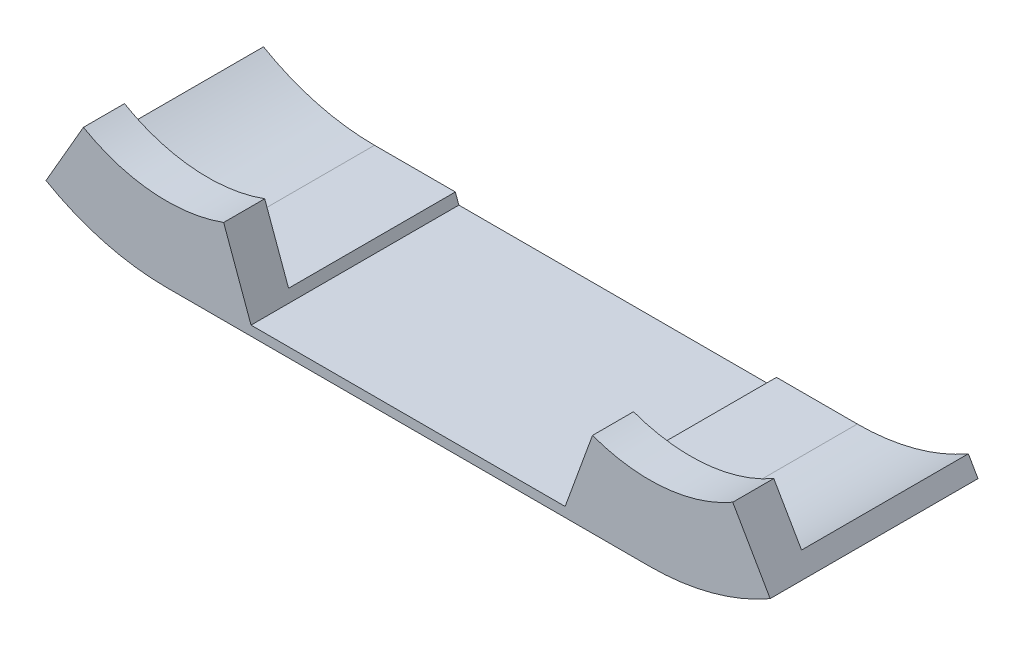
ISO-10303-21;
HEADER;
FILE_DESCRIPTION(('STEP AP214'),'2;1');
FILE_NAME('part.step','',(''),(''),'','','');
FILE_SCHEMA(('AUTOMOTIVE_DESIGN { 1 0 10303 214 1 1 1 1 }'));
ENDSEC;
DATA;
#1=APPLICATION_CONTEXT('core data for automotive mechanical design processes');
#2=APPLICATION_PROTOCOL_DEFINITION('international standard','automotive_design',2000,#1);
#3=PRODUCT_CONTEXT('',#1,'mechanical');
#4=PRODUCT('Part','Part','',(#3));
#5=PRODUCT_RELATED_PRODUCT_CATEGORY('part','',(#4));
#6=PRODUCT_DEFINITION_FORMATION('','',#4);
#7=PRODUCT_DEFINITION_CONTEXT('part definition',#1,'design');
#8=PRODUCT_DEFINITION('design','',#6,#7);
#9=PRODUCT_DEFINITION_SHAPE('','',#8);
#10=(LENGTH_UNIT() NAMED_UNIT(*) SI_UNIT(.MILLI.,.METRE.));
#11=(NAMED_UNIT(*) PLANE_ANGLE_UNIT() SI_UNIT($,.RADIAN.));
#12=(NAMED_UNIT(*) SI_UNIT($,.STERADIAN.) SOLID_ANGLE_UNIT());
#13=UNCERTAINTY_MEASURE_WITH_UNIT(LENGTH_MEASURE(1.E-05),#10,'distance_accuracy_value','');
#14=(GEOMETRIC_REPRESENTATION_CONTEXT(3) GLOBAL_UNCERTAINTY_ASSIGNED_CONTEXT((#13)) GLOBAL_UNIT_ASSIGNED_CONTEXT((#10,
#11,#12)) REPRESENTATION_CONTEXT('',''));
#15=CARTESIAN_POINT('',(0.,0.,0.));
#16=DIRECTION('',(0.,0.,1.));
#17=DIRECTION('',(1.,0.,0.));
#18=AXIS2_PLACEMENT_3D('',#15,#16,#17);
#19=CARTESIAN_POINT('',(0.,0.,0.));
#20=DIRECTION('',(0.,0.,-1.));
#21=DIRECTION('',(-1.,0.,0.));
#22=AXIS2_PLACEMENT_3D('',#19,#20,#21);
#23=PLANE('',#22);
#24=DIRECTION('',(-0.500000000000002,0.866025403784437,0.));
#25=VECTOR('',#24,1.);
#26=CARTESIAN_POINT('',(125.,-43.3012701892219,0.));
#27=LINE('',#26,#25);
#28=CARTESIAN_POINT('',(123.,-39.8371685740842,0.));
#29=VERTEX_POINT('',#28);
#30=CARTESIAN_POINT('',(117.25,-29.8778764305631,0.));
#31=VERTEX_POINT('',#30);
#32=EDGE_CURVE('E145',#29,#31,#27,.T.);
#33=ORIENTED_EDGE('',*,*,#32,.F.);
#34=CARTESIAN_POINT('',(100.,0.,0.));
#35=DIRECTION('',(0.,0.,-1.));
#36=DIRECTION('',(1.,0.,0.));
#37=AXIS2_PLACEMENT_3D('',#34,#35,#36);
#38=CIRCLE('',#37,46.);
#39=CARTESIAN_POINT('',(100.,-46.,0.));
#40=VERTEX_POINT('',#39);
#41=EDGE_CURVE('E254',#29,#40,#38,.T.);
#42=ORIENTED_EDGE('',*,*,#41,.T.);
#43=DIRECTION('',(-1.,0.,0.));
#44=VECTOR('',#43,1.);
#45=CARTESIAN_POINT('',(100.,-46.,0.));
#46=LINE('',#45,#44);
#47=CARTESIAN_POINT('',(83.2573692237546,-46.,0.));
#48=VERTEX_POINT('',#47);
#49=EDGE_CURVE('E258',#40,#48,#46,.T.);
#50=ORIENTED_EDGE('',*,*,#49,.T.);
#51=DIRECTION('',(-0.34202014332567,-0.939692620785908,0.));
#52=VECTOR('',#51,1.);
#53=CARTESIAN_POINT('',(88.2003050552644,-32.4193954171138,0.));
#54=LINE('',#53,#52);
#55=CARTESIAN_POINT('',(88.2003050552644,-32.4193954171138,0.));
#56=VERTEX_POINT('',#55);
#57=EDGE_CURVE('E152',#56,#48,#54,.T.);
#58=ORIENTED_EDGE('',*,*,#57,.F.);
#59=CARTESIAN_POINT('',(100.,0.,0.));
#60=DIRECTION('',(0.,0.,-1.));
#61=DIRECTION('',(-1.,0.,0.));
#62=AXIS2_PLACEMENT_3D('',#59,#60,#61);
#63=CIRCLE('',#62,34.5);
#64=EDGE_CURVE('E148',#31,#56,#63,.T.);
#65=ORIENTED_EDGE('',*,*,#64,.F.);
#66=EDGE_LOOP('',(#33,#42,#50,#58,#65));
#67=FACE_BOUND('',#66,.T.);
#68=ADVANCED_FACE('F39',(#67),#23,.T.);
#69=DIRECTION('',(-1.,0.,0.));
#70=VECTOR('',#69,1.);
#71=CARTESIAN_POINT('',(0.,-46.,0.));
#72=LINE('',#71,#70);
#73=CARTESIAN_POINT('',(16.7426307762454,-46.,0.));
#74=VERTEX_POINT('',#73);
#75=CARTESIAN_POINT('',(0.,-46.,0.));
#76=VERTEX_POINT('',#75);
#77=EDGE_CURVE('E262',#74,#76,#72,.T.);
#78=ORIENTED_EDGE('',*,*,#77,.T.);
#79=CARTESIAN_POINT('',(0.,0.,0.));
#80=DIRECTION('',(0.,0.,-1.));
#81=DIRECTION('',(-1.,0.,0.));
#82=AXIS2_PLACEMENT_3D('',#79,#80,#81);
#83=CIRCLE('',#82,46.);
#84=CARTESIAN_POINT('',(-23.,-39.8371685740842,0.));
#85=VERTEX_POINT('',#84);
#86=EDGE_CURVE('E55',#76,#85,#83,.T.);
#87=ORIENTED_EDGE('',*,*,#86,.T.);
#88=DIRECTION('',(-0.500000000000001,-0.866025403784438,0.));
#89=VECTOR('',#88,1.);
#90=CARTESIAN_POINT('',(-25.,-43.3012701892219,0.));
#91=LINE('',#90,#89);
#92=CARTESIAN_POINT('',(-17.25,-29.8778764305631,0.));
#93=VERTEX_POINT('',#92);
#94=EDGE_CURVE('E160',#93,#85,#91,.T.);
#95=ORIENTED_EDGE('',*,*,#94,.F.);
#96=CARTESIAN_POINT('',(0.,0.,0.));
#97=DIRECTION('',(0.,0.,-1.));
#98=DIRECTION('',(-1.,0.,0.));
#99=AXIS2_PLACEMENT_3D('',#96,#97,#98);
#100=CIRCLE('',#99,34.5);
#101=CARTESIAN_POINT('',(11.7996949447356,-32.4193954171138,0.));
#102=VERTEX_POINT('',#101);
#103=EDGE_CURVE('E86',#102,#93,#100,.T.);
#104=ORIENTED_EDGE('',*,*,#103,.F.);
#105=DIRECTION('',(-0.34202014332567,0.939692620785908,0.));
#106=VECTOR('',#105,1.);
#107=CARTESIAN_POINT('',(11.7996949447356,-32.4193954171138,0.));
#108=LINE('',#107,#106);
#109=EDGE_CURVE('E132',#74,#102,#108,.T.);
#110=ORIENTED_EDGE('',*,*,#109,.F.);
#111=EDGE_LOOP('',(#78,#87,#95,#104,#110));
#112=FACE_BOUND('',#111,.T.);
#113=ADVANCED_FACE('F373',(#112),#23,.T.);
#114=CARTESIAN_POINT('',(0.,0.,8.5));
#115=DIRECTION('',(0.,0.,-1.));
#116=DIRECTION('',(-1.,0.,0.));
#117=AXIS2_PLACEMENT_3D('',#114,#115,#116);
#118=CYLINDRICAL_SURFACE('',#117,50.);
#119=DIRECTION('',(0.,0.,-1.));
#120=VECTOR('',#119,1.);
#121=CARTESIAN_POINT('',(-25.,-43.3012701892219,8.5));
#122=LINE('',#121,#120);
#123=CARTESIAN_POINT('',(-25.,-43.3012701892219,8.5));
#124=VERTEX_POINT('',#123);
#125=CARTESIAN_POINT('',(-25.,-43.3012701892219,-34.55));
#126=VERTEX_POINT('',#125);
#127=EDGE_CURVE('E141',#124,#126,#122,.T.);
#128=ORIENTED_EDGE('',*,*,#127,.T.);
#129=CARTESIAN_POINT('',(0.,0.,-34.55));
#130=DIRECTION('',(0.,0.,1.));
#131=DIRECTION('',(1.,0.,0.));
#132=AXIS2_PLACEMENT_3D('',#129,#130,#131);
#133=CIRCLE('',#132,50.);
#134=CARTESIAN_POINT('',(0.,-50.,-34.55));
#135=VERTEX_POINT('',#134);
#136=EDGE_CURVE('E218',#126,#135,#133,.T.);
#137=ORIENTED_EDGE('',*,*,#136,.T.);
#138=DIRECTION('',(0.,0.,-1.));
#139=VECTOR('',#138,1.);
#140=CARTESIAN_POINT('',(0.,-50.,8.5));
#141=LINE('',#140,#139);
#142=CARTESIAN_POINT('',(0.,-50.,8.5));
#143=VERTEX_POINT('',#142);
#144=EDGE_CURVE('E11',#143,#135,#141,.T.);
#145=ORIENTED_EDGE('',*,*,#144,.F.);
#146=CARTESIAN_POINT('',(0.,0.,8.5));
#147=DIRECTION('',(0.,0.,1.));
#148=DIRECTION('',(-1.,0.,0.));
#149=AXIS2_PLACEMENT_3D('',#146,#147,#148);
#150=CIRCLE('',#149,50.);
#151=EDGE_CURVE('E164',#124,#143,#150,.T.);
#152=ORIENTED_EDGE('',*,*,#151,.F.);
#153=EDGE_LOOP('',(#128,#137,#145,#152));
#154=FACE_BOUND('',#153,.T.);
#155=ADVANCED_FACE('F41',(#154),#118,.T.);
#156=CARTESIAN_POINT('',(100.,-50.,8.5));
#157=DIRECTION('',(0.,1.,0.));
#158=DIRECTION('',(0.,0.,1.));
#159=AXIS2_PLACEMENT_3D('',#156,#157,#158);
#160=PLANE('',#159);
#161=ORIENTED_EDGE('',*,*,#144,.T.);
#162=DIRECTION('',(1.,0.,0.));
#163=VECTOR('',#162,1.);
#164=CARTESIAN_POINT('',(0.,-50.,-34.55));
#165=LINE('',#164,#163);
#166=CARTESIAN_POINT('',(100.,-50.,-34.55));
#167=VERTEX_POINT('',#166);
#168=EDGE_CURVE('E208',#135,#167,#165,.T.);
#169=ORIENTED_EDGE('',*,*,#168,.T.);
#170=DIRECTION('',(0.,0.,-1.));
#171=VECTOR('',#170,1.);
#172=CARTESIAN_POINT('',(100.,-50.,8.5));
#173=LINE('',#172,#171);
#174=CARTESIAN_POINT('',(100.,-50.,8.5));
#175=VERTEX_POINT('',#174);
#176=EDGE_CURVE('E48',#175,#167,#173,.T.);
#177=ORIENTED_EDGE('',*,*,#176,.F.);
#178=DIRECTION('',(1.,0.,0.));
#179=VECTOR('',#178,1.);
#180=CARTESIAN_POINT('',(0.,-50.,8.5));
#181=LINE('',#180,#179);
#182=EDGE_CURVE('E94',#143,#175,#181,.T.);
#183=ORIENTED_EDGE('',*,*,#182,.F.);
#184=EDGE_LOOP('',(#161,#169,#177,#183));
#185=FACE_BOUND('',#184,.T.);
#186=ADVANCED_FACE('F215',(#185),#160,.F.);
#187=CARTESIAN_POINT('',(100.,0.,8.5));
#188=DIRECTION('',(0.,0.,-1.));
#189=DIRECTION('',(-1.,0.,0.));
#190=AXIS2_PLACEMENT_3D('',#187,#188,#189);
#191=CYLINDRICAL_SURFACE('',#190,50.);
#192=ORIENTED_EDGE('',*,*,#176,.T.);
#193=CARTESIAN_POINT('',(100.,0.,-34.55));
#194=DIRECTION('',(0.,0.,1.));
#195=DIRECTION('',(-1.,0.,0.));
#196=AXIS2_PLACEMENT_3D('',#193,#194,#195);
#197=CIRCLE('',#196,50.);
#198=CARTESIAN_POINT('',(125.,-43.3012701892219,-34.55));
#199=VERTEX_POINT('',#198);
#200=EDGE_CURVE('E197',#167,#199,#197,.T.);
#201=ORIENTED_EDGE('',*,*,#200,.T.);
#202=DIRECTION('',(0.,0.,-1.));
#203=VECTOR('',#202,1.);
#204=CARTESIAN_POINT('',(125.,-43.3012701892219,8.5));
#205=LINE('',#204,#203);
#206=CARTESIAN_POINT('',(125.,-43.3012701892219,8.5));
#207=VERTEX_POINT('',#206);
#208=EDGE_CURVE('E184',#207,#199,#205,.T.);
#209=ORIENTED_EDGE('',*,*,#208,.F.);
#210=CARTESIAN_POINT('',(100.,0.,8.5));
#211=DIRECTION('',(0.,0.,1.));
#212=DIRECTION('',(1.,0.,0.));
#213=AXIS2_PLACEMENT_3D('',#210,#211,#212);
#214=CIRCLE('',#213,50.);
#215=EDGE_CURVE('E198',#175,#207,#214,.T.);
#216=ORIENTED_EDGE('',*,*,#215,.F.);
#217=EDGE_LOOP('',(#192,#201,#209,#216));
#218=FACE_BOUND('',#217,.T.);
#219=ADVANCED_FACE('F194',(#218),#191,.T.);
#220=CARTESIAN_POINT('',(125.,-43.3012701892219,8.5));
#221=DIRECTION('',(-0.866025403784438,-0.500000000000002,0.));
#222=DIRECTION('',(0.500000000000002,-0.866025403784437,0.));
#223=AXIS2_PLACEMENT_3D('',#220,#221,#222);
#224=PLANE('',#223);
#225=ORIENTED_EDGE('',*,*,#208,.T.);
#226=DIRECTION('',(-0.500000000000003,0.866025403784437,0.));
#227=VECTOR('',#226,1.);
#228=CARTESIAN_POINT('',(123.,-39.8371685740842,-34.55));
#229=LINE('',#228,#227);
#230=CARTESIAN_POINT('',(123.,-39.8371685740842,-34.55));
#231=VERTEX_POINT('',#230);
#232=EDGE_CURVE('E212',#199,#231,#229,.T.);
#233=ORIENTED_EDGE('',*,*,#232,.T.);
#234=DIRECTION('',(0.,0.,1.));
#235=VECTOR('',#234,1.);
#236=CARTESIAN_POINT('',(123.,-39.8371685740842,-34.55));
#237=LINE('',#236,#235);
#238=EDGE_CURVE('E280',#231,#29,#237,.T.);
#239=ORIENTED_EDGE('',*,*,#238,.T.);
#240=ORIENTED_EDGE('',*,*,#32,.T.);
#241=DIRECTION('',(0.,0.,-1.));
#242=VECTOR('',#241,1.);
#243=CARTESIAN_POINT('',(117.25,-29.8778764305631,8.5));
#244=LINE('',#243,#242);
#245=CARTESIAN_POINT('',(117.25,-29.8778764305631,8.5));
#246=VERTEX_POINT('',#245);
#247=EDGE_CURVE('E180',#246,#31,#244,.T.);
#248=ORIENTED_EDGE('',*,*,#247,.F.);
#249=DIRECTION('',(-0.500000000000002,0.866025403784437,0.));
#250=VECTOR('',#249,1.);
#251=CARTESIAN_POINT('',(125.,-43.3012701892219,8.5));
#252=LINE('',#251,#250);
#253=EDGE_CURVE('E292',#207,#246,#252,.T.);
#254=ORIENTED_EDGE('',*,*,#253,.F.);
#255=EDGE_LOOP('',(#225,#233,#239,#240,#248,#254));
#256=FACE_BOUND('',#255,.T.);
#257=ADVANCED_FACE('F361',(#256),#224,.F.);
#258=CARTESIAN_POINT('',(100.,0.,8.5));
#259=DIRECTION('',(0.,0.,-1.));
#260=DIRECTION('',(-1.,0.,0.));
#261=AXIS2_PLACEMENT_3D('',#258,#259,#260);
#262=CYLINDRICAL_SURFACE('',#261,34.5);
#263=ORIENTED_EDGE('',*,*,#64,.T.);
#264=DIRECTION('',(0.,0.,-1.));
#265=VECTOR('',#264,1.);
#266=CARTESIAN_POINT('',(88.2003050552644,-32.4193954171138,8.5));
#267=LINE('',#266,#265);
#268=CARTESIAN_POINT('',(88.2003050552644,-32.4193954171138,8.5));
#269=VERTEX_POINT('',#268);
#270=EDGE_CURVE('E176',#269,#56,#267,.T.);
#271=ORIENTED_EDGE('',*,*,#270,.F.);
#272=CARTESIAN_POINT('',(100.,0.,8.5));
#273=DIRECTION('',(0.,0.,-1.));
#274=DIRECTION('',(1.,0.,0.));
#275=AXIS2_PLACEMENT_3D('',#272,#273,#274);
#276=CIRCLE('',#275,34.5);
#277=EDGE_CURVE('E295',#246,#269,#276,.T.);
#278=ORIENTED_EDGE('',*,*,#277,.F.);
#279=ORIENTED_EDGE('',*,*,#247,.T.);
#280=EDGE_LOOP('',(#263,#271,#278,#279));
#281=FACE_BOUND('',#280,.T.);
#282=ADVANCED_FACE('F394',(#281),#262,.F.);
#283=CARTESIAN_POINT('',(88.2003050552644,-32.4193954171138,8.5));
#284=DIRECTION('',(0.939692620785908,-0.34202014332567,0.));
#285=DIRECTION('',(0.34202014332567,0.939692620785908,0.));
#286=AXIS2_PLACEMENT_3D('',#283,#284,#285);
#287=PLANE('',#286);
#288=ORIENTED_EDGE('',*,*,#57,.T.);
#289=DIRECTION('',(0.,0.,1.));
#290=VECTOR('',#289,1.);
#291=CARTESIAN_POINT('',(83.2573692237546,-46.,-34.55));
#292=LINE('',#291,#290);
#293=CARTESIAN_POINT('',(83.2573692237546,-46.,-34.55));
#294=VERTEX_POINT('',#293);
#295=EDGE_CURVE('E272',#294,#48,#292,.T.);
#296=ORIENTED_EDGE('',*,*,#295,.F.);
#297=DIRECTION('',(-0.342020143325662,-0.939692620785911,0.));
#298=VECTOR('',#297,1.);
#299=CARTESIAN_POINT('',(83.2573692237546,-46.,-34.55));
#300=LINE('',#299,#298);
#301=CARTESIAN_POINT('',(82.5294287552222,-48.,-34.55));
#302=VERTEX_POINT('',#301);
#303=EDGE_CURVE('E235',#294,#302,#300,.T.);
#304=ORIENTED_EDGE('',*,*,#303,.T.);
#305=DIRECTION('',(0.,0.,-1.));
#306=VECTOR('',#305,1.);
#307=CARTESIAN_POINT('',(82.5294287552222,-48.,8.5));
#308=LINE('',#307,#306);
#309=CARTESIAN_POINT('',(82.5294287552222,-48.,8.5));
#310=VERTEX_POINT('',#309);
#311=EDGE_CURVE('E172',#310,#302,#308,.T.);
#312=ORIENTED_EDGE('',*,*,#311,.F.);
#313=DIRECTION('',(-0.34202014332567,-0.939692620785908,0.));
#314=VECTOR('',#313,1.);
#315=CARTESIAN_POINT('',(88.2003050552644,-32.4193954171138,8.5));
#316=LINE('',#315,#314);
#317=EDGE_CURVE('E298',#269,#310,#316,.T.);
#318=ORIENTED_EDGE('',*,*,#317,.F.);
#319=ORIENTED_EDGE('',*,*,#270,.T.);
#320=EDGE_LOOP('',(#288,#296,#304,#312,#318,#319));
#321=FACE_BOUND('',#320,.T.);
#322=ADVANCED_FACE('F306',(#321),#287,.F.);
#323=CARTESIAN_POINT('',(17.4705712447778,-48.,8.5));
#324=DIRECTION('',(0.,-1.,0.));
#325=DIRECTION('',(0.,0.,-1.));
#326=AXIS2_PLACEMENT_3D('',#323,#324,#325);
#327=PLANE('',#326);
#328=ORIENTED_EDGE('',*,*,#311,.T.);
#329=DIRECTION('',(-1.,0.,0.));
#330=VECTOR('',#329,1.);
#331=CARTESIAN_POINT('',(17.4705712447778,-48.,-34.55));
#332=LINE('',#331,#330);
#333=CARTESIAN_POINT('',(17.4705712447778,-48.,-34.55));
#334=VERTEX_POINT('',#333);
#335=EDGE_CURVE('E239',#302,#334,#332,.T.);
#336=ORIENTED_EDGE('',*,*,#335,.T.);
#337=DIRECTION('',(0.,0.,-1.));
#338=VECTOR('',#337,1.);
#339=CARTESIAN_POINT('',(17.4705712447778,-48.,8.5));
#340=LINE('',#339,#338);
#341=CARTESIAN_POINT('',(17.4705712447778,-48.,8.5));
#342=VERTEX_POINT('',#341);
#343=EDGE_CURVE('E134',#342,#334,#340,.T.);
#344=ORIENTED_EDGE('',*,*,#343,.F.);
#345=DIRECTION('',(-1.,0.,0.));
#346=VECTOR('',#345,1.);
#347=CARTESIAN_POINT('',(82.5294287552222,-48.,8.5));
#348=LINE('',#347,#346);
#349=EDGE_CURVE('E122',#310,#342,#348,.T.);
#350=ORIENTED_EDGE('',*,*,#349,.F.);
#351=EDGE_LOOP('',(#328,#336,#344,#350));
#352=FACE_BOUND('',#351,.T.);
#353=ADVANCED_FACE('F312',(#352),#327,.F.);
#354=CARTESIAN_POINT('',(11.7996949447356,-32.4193954171138,8.5));
#355=DIRECTION('',(-0.939692620785908,-0.34202014332567,0.));
#356=DIRECTION('',(0.34202014332567,-0.939692620785908,0.));
#357=AXIS2_PLACEMENT_3D('',#354,#355,#356);
#358=PLANE('',#357);
#359=ORIENTED_EDGE('',*,*,#343,.T.);
#360=DIRECTION('',(-0.342020143325669,0.939692620785908,0.));
#361=VECTOR('',#360,1.);
#362=CARTESIAN_POINT('',(16.7426307762454,-46.,-34.55));
#363=LINE('',#362,#361);
#364=CARTESIAN_POINT('',(16.7426307762454,-46.,-34.55));
#365=VERTEX_POINT('',#364);
#366=EDGE_CURVE('E243',#334,#365,#363,.T.);
#367=ORIENTED_EDGE('',*,*,#366,.T.);
#368=DIRECTION('',(0.,0.,1.));
#369=VECTOR('',#368,1.);
#370=CARTESIAN_POINT('',(16.7426307762454,-46.,-34.55));
#371=LINE('',#370,#369);
#372=EDGE_CURVE('E269',#365,#74,#371,.T.);
#373=ORIENTED_EDGE('',*,*,#372,.T.);
#374=ORIENTED_EDGE('',*,*,#109,.T.);
#375=DIRECTION('',(0.,0.,-1.));
#376=VECTOR('',#375,1.);
#377=CARTESIAN_POINT('',(11.7996949447356,-32.4193954171138,8.5));
#378=LINE('',#377,#376);
#379=CARTESIAN_POINT('',(11.7996949447356,-32.4193954171138,8.5));
#380=VERTEX_POINT('',#379);
#381=EDGE_CURVE('E128',#380,#102,#378,.T.);
#382=ORIENTED_EDGE('',*,*,#381,.F.);
#383=DIRECTION('',(-0.34202014332567,0.939692620785908,0.));
#384=VECTOR('',#383,1.);
#385=CARTESIAN_POINT('',(11.7996949447356,-32.4193954171138,8.5));
#386=LINE('',#385,#384);
#387=EDGE_CURVE('E116',#342,#380,#386,.T.);
#388=ORIENTED_EDGE('',*,*,#387,.F.);
#389=EDGE_LOOP('',(#359,#367,#373,#374,#382,#388));
#390=FACE_BOUND('',#389,.T.);
#391=ADVANCED_FACE('F129',(#390),#358,.F.);
#392=CARTESIAN_POINT('',(0.,0.,8.5));
#393=DIRECTION('',(0.,0.,-1.));
#394=DIRECTION('',(-1.,0.,0.));
#395=AXIS2_PLACEMENT_3D('',#392,#393,#394);
#396=CYLINDRICAL_SURFACE('',#395,34.5);
#397=ORIENTED_EDGE('',*,*,#103,.T.);
#398=DIRECTION('',(0.,0.,-1.));
#399=VECTOR('',#398,1.);
#400=CARTESIAN_POINT('',(-17.25,-29.8778764305631,8.5));
#401=LINE('',#400,#399);
#402=CARTESIAN_POINT('',(-17.25,-29.8778764305631,8.5));
#403=VERTEX_POINT('',#402);
#404=EDGE_CURVE('E135',#403,#93,#401,.T.);
#405=ORIENTED_EDGE('',*,*,#404,.F.);
#406=CARTESIAN_POINT('',(0.,0.,8.5));
#407=DIRECTION('',(0.,0.,-1.));
#408=DIRECTION('',(1.,0.,0.));
#409=AXIS2_PLACEMENT_3D('',#406,#407,#408);
#410=CIRCLE('',#409,34.5);
#411=EDGE_CURVE('E120',#380,#403,#410,.T.);
#412=ORIENTED_EDGE('',*,*,#411,.F.);
#413=ORIENTED_EDGE('',*,*,#381,.T.);
#414=EDGE_LOOP('',(#397,#405,#412,#413));
#415=FACE_BOUND('',#414,.T.);
#416=ADVANCED_FACE('F137',(#415),#396,.F.);
#417=CARTESIAN_POINT('',(-25.,-43.3012701892219,8.5));
#418=DIRECTION('',(0.866025403784438,-0.500000000000001,0.));
#419=DIRECTION('',(0.500000000000001,0.866025403784438,0.));
#420=AXIS2_PLACEMENT_3D('',#417,#418,#419);
#421=PLANE('',#420);
#422=ORIENTED_EDGE('',*,*,#94,.T.);
#423=DIRECTION('',(0.,0.,1.));
#424=VECTOR('',#423,1.);
#425=CARTESIAN_POINT('',(-23.,-39.8371685740842,-34.55));
#426=LINE('',#425,#424);
#427=CARTESIAN_POINT('',(-23.,-39.8371685740842,-34.55));
#428=VERTEX_POINT('',#427);
#429=EDGE_CURVE('E251',#428,#85,#426,.T.);
#430=ORIENTED_EDGE('',*,*,#429,.F.);
#431=DIRECTION('',(-0.500000000000004,-0.866025403784436,0.));
#432=VECTOR('',#431,1.);
#433=CARTESIAN_POINT('',(-23.,-39.8371685740842,-34.55));
#434=LINE('',#433,#432);
#435=EDGE_CURVE('E221',#428,#126,#434,.T.);
#436=ORIENTED_EDGE('',*,*,#435,.T.);
#437=ORIENTED_EDGE('',*,*,#127,.F.);
#438=DIRECTION('',(-0.500000000000001,-0.866025403784438,0.));
#439=VECTOR('',#438,1.);
#440=CARTESIAN_POINT('',(-25.,-43.3012701892219,8.5));
#441=LINE('',#440,#439);
#442=EDGE_CURVE('E64',#403,#124,#441,.T.);
#443=ORIENTED_EDGE('',*,*,#442,.F.);
#444=ORIENTED_EDGE('',*,*,#404,.T.);
#445=EDGE_LOOP('',(#422,#430,#436,#437,#443,#444));
#446=FACE_BOUND('',#445,.T.);
#447=ADVANCED_FACE('F366',(#446),#421,.F.);
#448=CARTESIAN_POINT('',(0.,0.,8.5));
#449=DIRECTION('',(0.,0.,-1.));
#450=DIRECTION('',(-1.,0.,0.));
#451=AXIS2_PLACEMENT_3D('',#448,#449,#450);
#452=PLANE('',#451);
#453=ORIENTED_EDGE('',*,*,#151,.T.);
#454=ORIENTED_EDGE('',*,*,#182,.T.);
#455=ORIENTED_EDGE('',*,*,#215,.T.);
#456=ORIENTED_EDGE('',*,*,#253,.T.);
#457=ORIENTED_EDGE('',*,*,#277,.T.);
#458=ORIENTED_EDGE('',*,*,#317,.T.);
#459=ORIENTED_EDGE('',*,*,#349,.T.);
#460=ORIENTED_EDGE('',*,*,#387,.T.);
#461=ORIENTED_EDGE('',*,*,#411,.T.);
#462=ORIENTED_EDGE('',*,*,#442,.T.);
#463=EDGE_LOOP('',(#453,#454,#455,#456,#457,#458,#459,#460,#461,#462));
#464=FACE_BOUND('',#463,.T.);
#465=ADVANCED_FACE('F118',(#464),#452,.F.);
#466=CARTESIAN_POINT('',(0.,0.,-34.55));
#467=DIRECTION('',(0.,0.,1.));
#468=DIRECTION('',(1.,0.,0.));
#469=AXIS2_PLACEMENT_3D('',#466,#467,#468);
#470=CYLINDRICAL_SURFACE('',#469,46.);
#471=ORIENTED_EDGE('',*,*,#86,.F.);
#472=DIRECTION('',(0.,0.,1.));
#473=VECTOR('',#472,1.);
#474=CARTESIAN_POINT('',(0.,-46.,-34.55));
#475=LINE('',#474,#473);
#476=CARTESIAN_POINT('',(0.,-46.,-34.55));
#477=VERTEX_POINT('',#476);
#478=EDGE_CURVE('E149',#477,#76,#475,.T.);
#479=ORIENTED_EDGE('',*,*,#478,.F.);
#480=CARTESIAN_POINT('',(0.,0.,-34.55));
#481=DIRECTION('',(0.,0.,-1.));
#482=DIRECTION('',(-1.,0.,0.));
#483=AXIS2_PLACEMENT_3D('',#480,#481,#482);
#484=CIRCLE('',#483,46.);
#485=EDGE_CURVE('E266',#477,#428,#484,.T.);
#486=ORIENTED_EDGE('',*,*,#485,.T.);
#487=ORIENTED_EDGE('',*,*,#429,.T.);
#488=EDGE_LOOP('',(#471,#479,#486,#487));
#489=FACE_BOUND('',#488,.T.);
#490=ADVANCED_FACE('F370',(#489),#470,.F.);
#491=CARTESIAN_POINT('',(0.,-46.,-34.55));
#492=DIRECTION('',(0.,1.,0.));
#493=DIRECTION('',(0.,0.,1.));
#494=AXIS2_PLACEMENT_3D('',#491,#492,#493);
#495=PLANE('',#494);
#496=ORIENTED_EDGE('',*,*,#77,.F.);
#497=ORIENTED_EDGE('',*,*,#372,.F.);
#498=DIRECTION('',(-1.,0.,0.));
#499=VECTOR('',#498,1.);
#500=CARTESIAN_POINT('',(0.,-46.,-34.55));
#501=LINE('',#500,#499);
#502=EDGE_CURVE('E247',#365,#477,#501,.T.);
#503=ORIENTED_EDGE('',*,*,#502,.T.);
#504=ORIENTED_EDGE('',*,*,#478,.T.);
#505=EDGE_LOOP('',(#496,#497,#503,#504));
#506=FACE_BOUND('',#505,.T.);
#507=ADVANCED_FACE('F324',(#506),#495,.T.);
#508=CARTESIAN_POINT('',(100.,-46.,-34.55));
#509=DIRECTION('',(0.,1.,0.));
#510=DIRECTION('',(0.,0.,1.));
#511=AXIS2_PLACEMENT_3D('',#508,#509,#510);
#512=PLANE('',#511);
#513=ORIENTED_EDGE('',*,*,#49,.F.);
#514=DIRECTION('',(0.,0.,1.));
#515=VECTOR('',#514,1.);
#516=CARTESIAN_POINT('',(100.,-46.,-34.55));
#517=LINE('',#516,#515);
#518=CARTESIAN_POINT('',(100.,-46.,-34.55));
#519=VERTEX_POINT('',#518);
#520=EDGE_CURVE('E276',#519,#40,#517,.T.);
#521=ORIENTED_EDGE('',*,*,#520,.F.);
#522=DIRECTION('',(-1.,0.,0.));
#523=VECTOR('',#522,1.);
#524=CARTESIAN_POINT('',(100.,-46.,-34.55));
#525=LINE('',#524,#523);
#526=EDGE_CURVE('E231',#519,#294,#525,.T.);
#527=ORIENTED_EDGE('',*,*,#526,.T.);
#528=ORIENTED_EDGE('',*,*,#295,.T.);
#529=EDGE_LOOP('',(#513,#521,#527,#528));
#530=FACE_BOUND('',#529,.T.);
#531=ADVANCED_FACE('F355',(#530),#512,.T.);
#532=CARTESIAN_POINT('',(100.,0.,-34.55));
#533=DIRECTION('',(0.,0.,1.));
#534=DIRECTION('',(1.,0.,0.));
#535=AXIS2_PLACEMENT_3D('',#532,#533,#534);
#536=CYLINDRICAL_SURFACE('',#535,46.);
#537=ORIENTED_EDGE('',*,*,#41,.F.);
#538=ORIENTED_EDGE('',*,*,#238,.F.);
#539=CARTESIAN_POINT('',(100.,0.,-34.55));
#540=DIRECTION('',(0.,0.,-1.));
#541=DIRECTION('',(1.,0.,0.));
#542=AXIS2_PLACEMENT_3D('',#539,#540,#541);
#543=CIRCLE('',#542,46.);
#544=EDGE_CURVE('E227',#231,#519,#543,.T.);
#545=ORIENTED_EDGE('',*,*,#544,.T.);
#546=ORIENTED_EDGE('',*,*,#520,.T.);
#547=EDGE_LOOP('',(#537,#538,#545,#546));
#548=FACE_BOUND('',#547,.T.);
#549=ADVANCED_FACE('F358',(#548),#536,.F.);
#550=CARTESIAN_POINT('',(0.,0.,-34.55));
#551=DIRECTION('',(0.,0.,-1.));
#552=DIRECTION('',(-1.,0.,0.));
#553=AXIS2_PLACEMENT_3D('',#550,#551,#552);
#554=PLANE('',#553);
#555=ORIENTED_EDGE('',*,*,#485,.F.);
#556=ORIENTED_EDGE('',*,*,#502,.F.);
#557=ORIENTED_EDGE('',*,*,#366,.F.);
#558=ORIENTED_EDGE('',*,*,#335,.F.);
#559=ORIENTED_EDGE('',*,*,#303,.F.);
#560=ORIENTED_EDGE('',*,*,#526,.F.);
#561=ORIENTED_EDGE('',*,*,#544,.F.);
#562=ORIENTED_EDGE('',*,*,#232,.F.);
#563=ORIENTED_EDGE('',*,*,#200,.F.);
#564=ORIENTED_EDGE('',*,*,#168,.F.);
#565=ORIENTED_EDGE('',*,*,#136,.F.);
#566=ORIENTED_EDGE('',*,*,#435,.F.);
#567=EDGE_LOOP('',(#555,#556,#557,#558,#559,#560,#561,#562,#563,#564,#565,#566));
#568=FACE_BOUND('',#567,.T.);
#569=ADVANCED_FACE('F206',(#568),#554,.T.);
#570=CLOSED_SHELL('',(#68,#113,#155,#186,#219,#257,#282,#322,#353,#391,#416,#447,#465,#490,#507,
#531,#549,#569));
#571=MANIFOLD_SOLID_BREP('B2',#570);
#572=ADVANCED_BREP_SHAPE_REPRESENTATION('',(#18,#571),#14);
#573=SHAPE_DEFINITION_REPRESENTATION(#9,#572);
ENDSEC;
END-ISO-10303-21;
